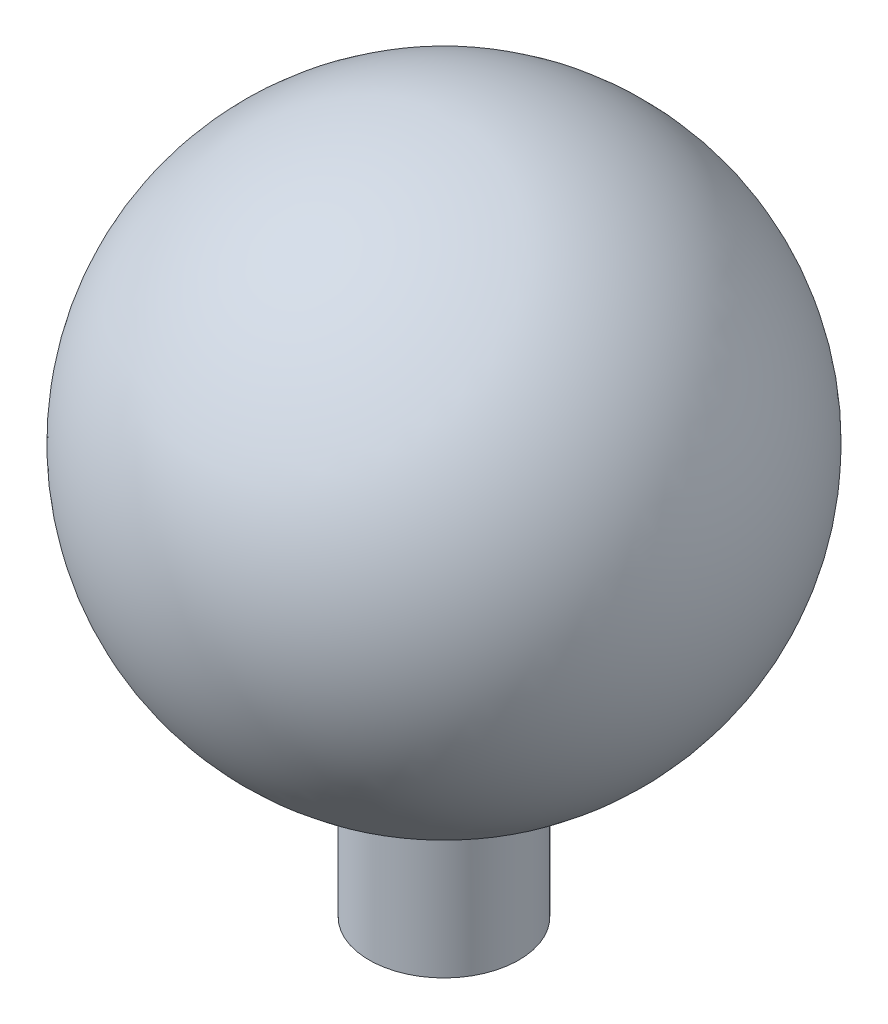
ISO-10303-21;
HEADER;
FILE_DESCRIPTION(('STEP AP214'),'2;1');
FILE_NAME('part.step','',(''),(''),'','','');
FILE_SCHEMA(('AUTOMOTIVE_DESIGN { 1 0 10303 214 1 1 1 1 }'));
ENDSEC;
DATA;
#1=APPLICATION_CONTEXT('core data for automotive mechanical design processes');
#2=APPLICATION_PROTOCOL_DEFINITION('international standard','automotive_design',2000,#1);
#3=PRODUCT_CONTEXT('',#1,'mechanical');
#4=PRODUCT('Part','Part','',(#3));
#5=PRODUCT_RELATED_PRODUCT_CATEGORY('part','',(#4));
#6=PRODUCT_DEFINITION_FORMATION('','',#4);
#7=PRODUCT_DEFINITION_CONTEXT('part definition',#1,'design');
#8=PRODUCT_DEFINITION('design','',#6,#7);
#9=PRODUCT_DEFINITION_SHAPE('','',#8);
#10=(LENGTH_UNIT() NAMED_UNIT(*) SI_UNIT(.MILLI.,.METRE.));
#11=(NAMED_UNIT(*) PLANE_ANGLE_UNIT() SI_UNIT($,.RADIAN.));
#12=(NAMED_UNIT(*) SI_UNIT($,.STERADIAN.) SOLID_ANGLE_UNIT());
#13=UNCERTAINTY_MEASURE_WITH_UNIT(LENGTH_MEASURE(1.E-05),#10,'distance_accuracy_value','');
#14=(GEOMETRIC_REPRESENTATION_CONTEXT(3) GLOBAL_UNCERTAINTY_ASSIGNED_CONTEXT((#13)) GLOBAL_UNIT_ASSIGNED_CONTEXT((#10,
#11,#12)) REPRESENTATION_CONTEXT('',''));
#15=CARTESIAN_POINT('',(0.,0.,0.));
#16=DIRECTION('',(0.,0.,1.));
#17=DIRECTION('',(1.,0.,0.));
#18=AXIS2_PLACEMENT_3D('',#15,#16,#17);
#19=CARTESIAN_POINT('',(0.,0.,0.));
#20=DIRECTION('',(0.,1.,0.));
#21=DIRECTION('',(0.,0.,1.));
#22=AXIS2_PLACEMENT_3D('',#19,#20,#21);
#23=PLANE('',#22);
#24=CARTESIAN_POINT('',(0.,0.,0.));
#25=DIRECTION('',(0.,-1.,0.));
#26=DIRECTION('',(0.,0.,-1.));
#27=AXIS2_PLACEMENT_3D('',#24,#25,#26);
#28=CIRCLE('',#27,10.);
#29=CARTESIAN_POINT('',(0.,0.,-10.));
#30=VERTEX_POINT('',#29);
#31=EDGE_CURVE('E40',#30,#30,#28,.T.);
#32=ORIENTED_EDGE('',*,*,#31,.T.);
#33=EDGE_LOOP('',(#32));
#34=FACE_BOUND('',#33,.T.);
#35=ADVANCED_FACE('F34',(#34),#23,.F.);
#36=CARTESIAN_POINT('',(0.,54.7633354497314,0.));
#37=DIRECTION('',(0.,-1.,0.));
#38=DIRECTION('',(-1.,0.,0.));
#39=AXIS2_PLACEMENT_3D('',#36,#37,#38);
#40=SPHERICAL_SURFACE('',#39,37.5);
#41=CARTESIAN_POINT('',(0.,18.621254712729,0.));
#42=DIRECTION('',(0.,-1.,0.));
#43=DIRECTION('',(0.,0.,-1.));
#44=AXIS2_PLACEMENT_3D('',#41,#42,#43);
#45=CIRCLE('',#44,10.);
#46=CARTESIAN_POINT('',(0.,18.621254712729,-10.));
#47=VERTEX_POINT('',#46);
#48=EDGE_CURVE('E10',#47,#47,#45,.T.);
#49=ORIENTED_EDGE('',*,*,#48,.F.);
#50=EDGE_LOOP('',(#49));
#51=FACE_BOUND('',#50,.T.);
#52=ADVANCED_FACE('F49',(#51),#40,.T.);
#53=CARTESIAN_POINT('',(0.,0.,0.));
#54=DIRECTION('',(0.,-1.,0.));
#55=DIRECTION('',(0.,0.,-1.));
#56=AXIS2_PLACEMENT_3D('',#53,#54,#55);
#57=CYLINDRICAL_SURFACE('',#56,10.);
#58=ORIENTED_EDGE('',*,*,#31,.F.);
#59=EDGE_LOOP('',(#58));
#60=FACE_BOUND('',#59,.T.);
#61=ORIENTED_EDGE('',*,*,#48,.T.);
#62=EDGE_LOOP('',(#61));
#63=FACE_BOUND('',#62,.T.);
#64=ADVANCED_FACE('F47',(#60,#63),#57,.T.);
#65=CLOSED_SHELL('',(#35,#52,#64));
#66=MANIFOLD_SOLID_BREP('B2',#65);
#67=ADVANCED_BREP_SHAPE_REPRESENTATION('',(#18,#66),#14);
#68=SHAPE_DEFINITION_REPRESENTATION(#9,#67);
ENDSEC;
END-ISO-10303-21;
